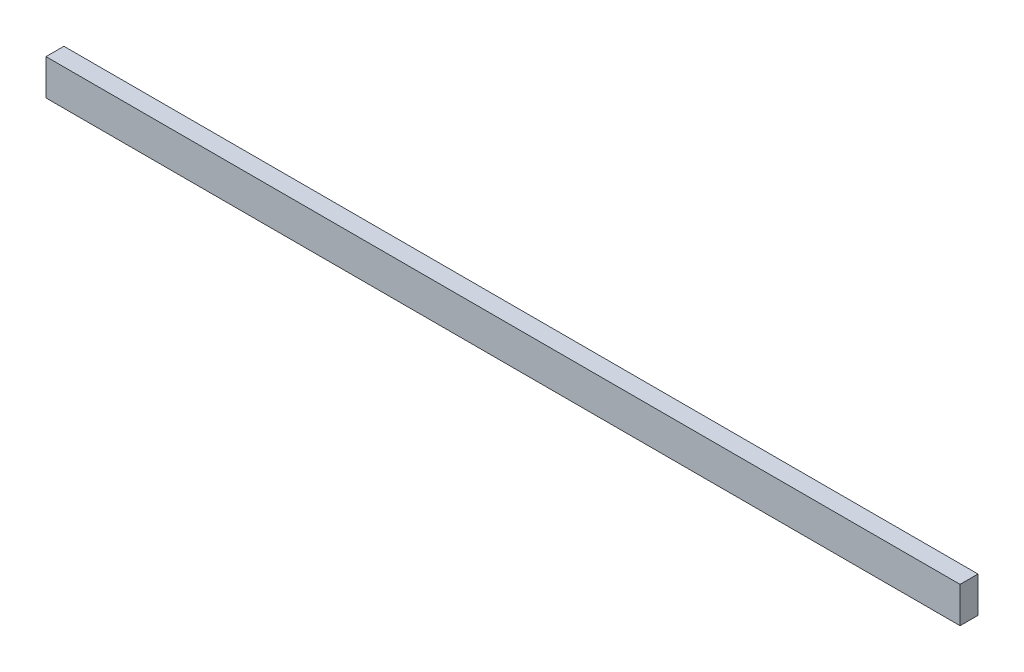
ISO-10303-21;
HEADER;
FILE_DESCRIPTION(('STEP AP214'),'2;1');
FILE_NAME('part.step','',(''),(''),'','','');
FILE_SCHEMA(('AUTOMOTIVE_DESIGN { 1 0 10303 214 1 1 1 1 }'));
ENDSEC;
DATA;
#1=APPLICATION_CONTEXT('core data for automotive mechanical design processes');
#2=APPLICATION_PROTOCOL_DEFINITION('international standard','automotive_design',2000,#1);
#3=PRODUCT_CONTEXT('',#1,'mechanical');
#4=PRODUCT('Part','Part','',(#3));
#5=PRODUCT_RELATED_PRODUCT_CATEGORY('part','',(#4));
#6=PRODUCT_DEFINITION_FORMATION('','',#4);
#7=PRODUCT_DEFINITION_CONTEXT('part definition',#1,'design');
#8=PRODUCT_DEFINITION('design','',#6,#7);
#9=PRODUCT_DEFINITION_SHAPE('','',#8);
#10=(LENGTH_UNIT() NAMED_UNIT(*) SI_UNIT(.MILLI.,.METRE.));
#11=(NAMED_UNIT(*) PLANE_ANGLE_UNIT() SI_UNIT($,.RADIAN.));
#12=(NAMED_UNIT(*) SI_UNIT($,.STERADIAN.) SOLID_ANGLE_UNIT());
#13=UNCERTAINTY_MEASURE_WITH_UNIT(LENGTH_MEASURE(1.E-05),#10,'distance_accuracy_value','');
#14=(GEOMETRIC_REPRESENTATION_CONTEXT(3) GLOBAL_UNCERTAINTY_ASSIGNED_CONTEXT((#13)) GLOBAL_UNIT_ASSIGNED_CONTEXT((#10,
#11,#12)) REPRESENTATION_CONTEXT('',''));
#15=CARTESIAN_POINT('',(0.,0.,0.));
#16=DIRECTION('',(0.,0.,1.));
#17=DIRECTION('',(1.,0.,0.));
#18=AXIS2_PLACEMENT_3D('',#15,#16,#17);
#19=CARTESIAN_POINT('',(25.5,-0.999999999999999,1.));
#20=DIRECTION('',(-1.,0.,0.));
#21=DIRECTION('',(0.,0.,1.));
#22=AXIS2_PLACEMENT_3D('',#19,#20,#21);
#23=PLANE('',#22);
#24=DIRECTION('',(0.,1.,0.));
#25=VECTOR('',#24,1.);
#26=CARTESIAN_POINT('',(25.5,-0.999999999999999,0.));
#27=LINE('',#26,#25);
#28=CARTESIAN_POINT('',(25.5,-0.999999999999999,0.));
#29=VERTEX_POINT('',#28);
#30=CARTESIAN_POINT('',(25.5,1.,0.));
#31=VERTEX_POINT('',#30);
#32=EDGE_CURVE('E96',#29,#31,#27,.T.);
#33=ORIENTED_EDGE('',*,*,#32,.T.);
#34=DIRECTION('',(0.,0.,-1.));
#35=VECTOR('',#34,1.);
#36=CARTESIAN_POINT('',(25.5,1.,1.));
#37=LINE('',#36,#35);
#38=CARTESIAN_POINT('',(25.5,1.,1.));
#39=VERTEX_POINT('',#38);
#40=EDGE_CURVE('E11',#39,#31,#37,.T.);
#41=ORIENTED_EDGE('',*,*,#40,.F.);
#42=DIRECTION('',(0.,1.,0.));
#43=VECTOR('',#42,1.);
#44=CARTESIAN_POINT('',(25.5,-0.999999999999999,1.));
#45=LINE('',#44,#43);
#46=CARTESIAN_POINT('',(25.5,-0.999999999999999,1.));
#47=VERTEX_POINT('',#46);
#48=EDGE_CURVE('E84',#47,#39,#45,.T.);
#49=ORIENTED_EDGE('',*,*,#48,.F.);
#50=DIRECTION('',(0.,0.,-1.));
#51=VECTOR('',#50,1.);
#52=CARTESIAN_POINT('',(25.5,-0.999999999999999,1.));
#53=LINE('',#52,#51);
#54=EDGE_CURVE('E92',#47,#29,#53,.T.);
#55=ORIENTED_EDGE('',*,*,#54,.T.);
#56=EDGE_LOOP('',(#33,#41,#49,#55));
#57=FACE_BOUND('',#56,.T.);
#58=ADVANCED_FACE('F33',(#57),#23,.F.);
#59=CARTESIAN_POINT('',(-25.5,1.,1.));
#60=DIRECTION('',(0.,-1.,0.));
#61=DIRECTION('',(0.,0.,-1.));
#62=AXIS2_PLACEMENT_3D('',#59,#60,#61);
#63=PLANE('',#62);
#64=DIRECTION('',(-1.,0.,0.));
#65=VECTOR('',#64,1.);
#66=CARTESIAN_POINT('',(-25.5,1.,0.));
#67=LINE('',#66,#65);
#68=CARTESIAN_POINT('',(-25.5,1.,0.));
#69=VERTEX_POINT('',#68);
#70=EDGE_CURVE('E88',#31,#69,#67,.T.);
#71=ORIENTED_EDGE('',*,*,#70,.T.);
#72=DIRECTION('',(0.,0.,-1.));
#73=VECTOR('',#72,1.);
#74=CARTESIAN_POINT('',(-25.5,1.,1.));
#75=LINE('',#74,#73);
#76=CARTESIAN_POINT('',(-25.5,1.,1.));
#77=VERTEX_POINT('',#76);
#78=EDGE_CURVE('E41',#77,#69,#75,.T.);
#79=ORIENTED_EDGE('',*,*,#78,.F.);
#80=DIRECTION('',(-1.,0.,0.));
#81=VECTOR('',#80,1.);
#82=CARTESIAN_POINT('',(-25.5,1.,1.));
#83=LINE('',#82,#81);
#84=EDGE_CURVE('E79',#39,#77,#83,.T.);
#85=ORIENTED_EDGE('',*,*,#84,.F.);
#86=ORIENTED_EDGE('',*,*,#40,.T.);
#87=EDGE_LOOP('',(#71,#79,#85,#86));
#88=FACE_BOUND('',#87,.T.);
#89=ADVANCED_FACE('F87',(#88),#63,.F.);
#90=CARTESIAN_POINT('',(-25.5,-0.999999999999999,1.));
#91=DIRECTION('',(1.,0.,0.));
#92=DIRECTION('',(0.,0.,-1.));
#93=AXIS2_PLACEMENT_3D('',#90,#91,#92);
#94=PLANE('',#93);
#95=DIRECTION('',(0.,-1.,0.));
#96=VECTOR('',#95,1.);
#97=CARTESIAN_POINT('',(-25.5,-0.999999999999999,0.));
#98=LINE('',#97,#96);
#99=CARTESIAN_POINT('',(-25.5,-0.999999999999999,0.));
#100=VERTEX_POINT('',#99);
#101=EDGE_CURVE('E66',#69,#100,#98,.T.);
#102=ORIENTED_EDGE('',*,*,#101,.T.);
#103=DIRECTION('',(0.,0.,-1.));
#104=VECTOR('',#103,1.);
#105=CARTESIAN_POINT('',(-25.5,-0.999999999999999,1.));
#106=LINE('',#105,#104);
#107=CARTESIAN_POINT('',(-25.5,-0.999999999999999,1.));
#108=VERTEX_POINT('',#107);
#109=EDGE_CURVE('E89',#108,#100,#106,.T.);
#110=ORIENTED_EDGE('',*,*,#109,.F.);
#111=DIRECTION('',(0.,-1.,0.));
#112=VECTOR('',#111,1.);
#113=CARTESIAN_POINT('',(-25.5,-0.999999999999999,1.));
#114=LINE('',#113,#112);
#115=EDGE_CURVE('E82',#77,#108,#114,.T.);
#116=ORIENTED_EDGE('',*,*,#115,.F.);
#117=ORIENTED_EDGE('',*,*,#78,.T.);
#118=EDGE_LOOP('',(#102,#110,#116,#117));
#119=FACE_BOUND('',#118,.T.);
#120=ADVANCED_FACE('F90',(#119),#94,.F.);
#121=CARTESIAN_POINT('',(-25.5,-0.999999999999999,1.));
#122=DIRECTION('',(0.,1.,0.));
#123=DIRECTION('',(0.,0.,1.));
#124=AXIS2_PLACEMENT_3D('',#121,#122,#123);
#125=PLANE('',#124);
#126=DIRECTION('',(1.,0.,0.));
#127=VECTOR('',#126,1.);
#128=CARTESIAN_POINT('',(-25.5,-0.999999999999999,0.));
#129=LINE('',#128,#127);
#130=EDGE_CURVE('E72',#100,#29,#129,.T.);
#131=ORIENTED_EDGE('',*,*,#130,.T.);
#132=ORIENTED_EDGE('',*,*,#54,.F.);
#133=DIRECTION('',(1.,0.,0.));
#134=VECTOR('',#133,1.);
#135=CARTESIAN_POINT('',(-25.5,-0.999999999999999,1.));
#136=LINE('',#135,#134);
#137=EDGE_CURVE('E49',#108,#47,#136,.T.);
#138=ORIENTED_EDGE('',*,*,#137,.F.);
#139=ORIENTED_EDGE('',*,*,#109,.T.);
#140=EDGE_LOOP('',(#131,#132,#138,#139));
#141=FACE_BOUND('',#140,.T.);
#142=ADVANCED_FACE('F103',(#141),#125,.F.);
#143=CARTESIAN_POINT('',(0.,0.,1.));
#144=DIRECTION('',(0.,0.,-1.));
#145=DIRECTION('',(-1.,0.,0.));
#146=AXIS2_PLACEMENT_3D('',#143,#144,#145);
#147=PLANE('',#146);
#148=ORIENTED_EDGE('',*,*,#48,.T.);
#149=ORIENTED_EDGE('',*,*,#84,.T.);
#150=ORIENTED_EDGE('',*,*,#115,.T.);
#151=ORIENTED_EDGE('',*,*,#137,.T.);
#152=EDGE_LOOP('',(#148,#149,#150,#151));
#153=FACE_BOUND('',#152,.T.);
#154=ADVANCED_FACE('F80',(#153),#147,.F.);
#155=CARTESIAN_POINT('',(0.,0.,0.));
#156=DIRECTION('',(0.,0.,-1.));
#157=DIRECTION('',(-1.,0.,0.));
#158=AXIS2_PLACEMENT_3D('',#155,#156,#157);
#159=PLANE('',#158);
#160=ORIENTED_EDGE('',*,*,#32,.F.);
#161=ORIENTED_EDGE('',*,*,#130,.F.);
#162=ORIENTED_EDGE('',*,*,#101,.F.);
#163=ORIENTED_EDGE('',*,*,#70,.F.);
#164=EDGE_LOOP('',(#160,#161,#162,#163));
#165=FACE_BOUND('',#164,.T.);
#166=ADVANCED_FACE('F106',(#165),#159,.T.);
#167=CLOSED_SHELL('',(#58,#89,#120,#142,#154,#166));
#168=MANIFOLD_SOLID_BREP('B2',#167);
#169=ADVANCED_BREP_SHAPE_REPRESENTATION('',(#18,#168),#14);
#170=SHAPE_DEFINITION_REPRESENTATION(#9,#169);
ENDSEC;
END-ISO-10303-21;
